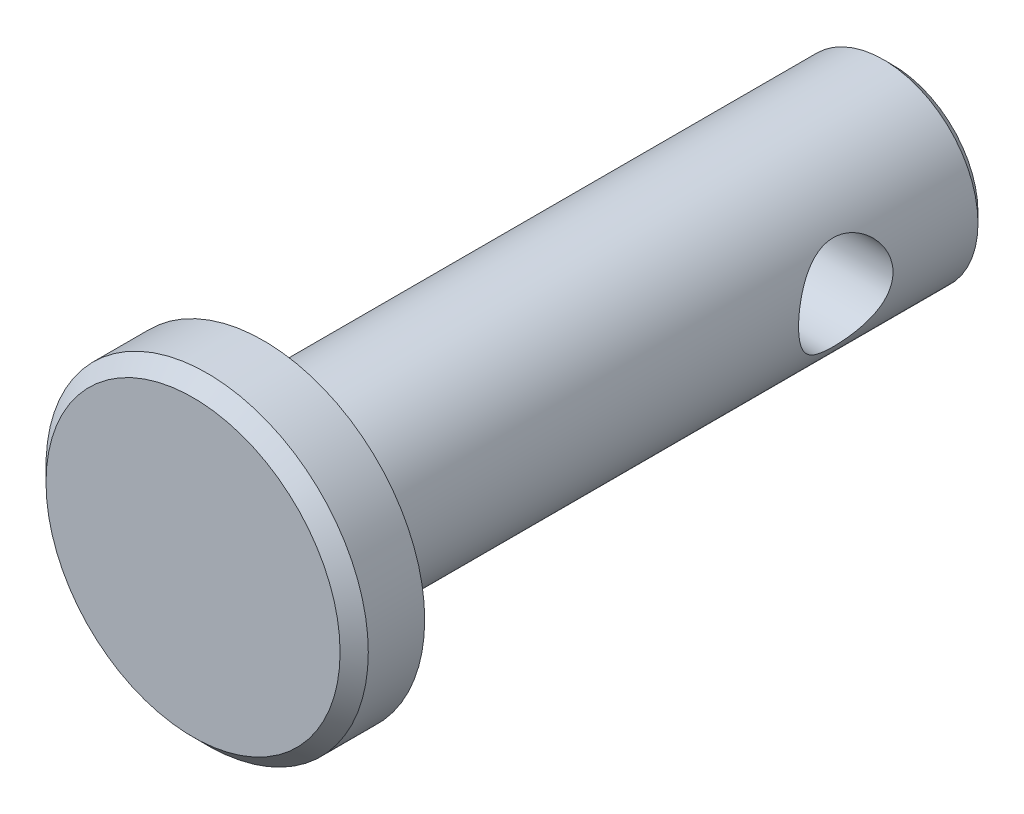
ISO-10303-21;
HEADER;
FILE_DESCRIPTION(('STEP AP214'),'2;1');
FILE_NAME('part.step','',(''),(''),'','','');
FILE_SCHEMA(('AUTOMOTIVE_DESIGN { 1 0 10303 214 1 1 1 1 }'));
ENDSEC;
DATA;
#1=APPLICATION_CONTEXT('core data for automotive mechanical design processes');
#2=APPLICATION_PROTOCOL_DEFINITION('international standard','automotive_design',2000,#1);
#3=PRODUCT_CONTEXT('',#1,'mechanical');
#4=PRODUCT('Part','Part','',(#3));
#5=PRODUCT_RELATED_PRODUCT_CATEGORY('part','',(#4));
#6=PRODUCT_DEFINITION_FORMATION('','',#4);
#7=PRODUCT_DEFINITION_CONTEXT('part definition',#1,'design');
#8=PRODUCT_DEFINITION('design','',#6,#7);
#9=PRODUCT_DEFINITION_SHAPE('','',#8);
#10=(LENGTH_UNIT() NAMED_UNIT(*) SI_UNIT(.MILLI.,.METRE.));
#11=(NAMED_UNIT(*) PLANE_ANGLE_UNIT() SI_UNIT($,.RADIAN.));
#12=(NAMED_UNIT(*) SI_UNIT($,.STERADIAN.) SOLID_ANGLE_UNIT());
#13=UNCERTAINTY_MEASURE_WITH_UNIT(LENGTH_MEASURE(1.E-05),#10,'distance_accuracy_value','');
#14=(GEOMETRIC_REPRESENTATION_CONTEXT(3) GLOBAL_UNCERTAINTY_ASSIGNED_CONTEXT((#13)) GLOBAL_UNIT_ASSIGNED_CONTEXT((#10,
#11,#12)) REPRESENTATION_CONTEXT('',''));
#15=CARTESIAN_POINT('',(0.,0.,0.));
#16=DIRECTION('',(0.,0.,1.));
#17=DIRECTION('',(1.,0.,0.));
#18=AXIS2_PLACEMENT_3D('',#15,#16,#17);
#19=CARTESIAN_POINT('',(0.,0.,7.9375));
#20=DIRECTION('',(0.,0.,-1.));
#21=DIRECTION('',(-1.,0.,0.));
#22=AXIS2_PLACEMENT_3D('',#19,#20,#21);
#23=CYLINDRICAL_SURFACE('',#22,2.38125);
#24=CARTESIAN_POINT('',(0.,0.,-7.699375));
#25=DIRECTION('',(0.,0.,1.));
#26=DIRECTION('',(1.,0.,0.));
#27=AXIS2_PLACEMENT_3D('',#24,#25,#26);
#28=CIRCLE('',#27,2.38125);
#29=CARTESIAN_POINT('',(2.38125,0.,-7.699375));
#30=VERTEX_POINT('',#29);
#31=EDGE_CURVE('E37',#30,#30,#28,.T.);
#32=ORIENTED_EDGE('',*,*,#31,.T.);
#33=EDGE_LOOP('',(#32));
#34=FACE_BOUND('',#33,.T.);
#35=CARTESIAN_POINT('',(-2.38125,0.,-3.17499999999999));
#36=CARTESIAN_POINT('',(-2.38124658771817,-0.0625934933908996,-3.17500393182414));
#37=CARTESIAN_POINT('',(-2.37875553370113,-0.12526160776547,-3.17996499331048));
#38=CARTESIAN_POINT('',(-2.36903604532025,-0.248745655116469,-3.19958983565589));
#39=CARTESIAN_POINT('',(-2.36179861446384,-0.309557840743266,-3.21427204291281));
#40=CARTESIAN_POINT('',(-2.34334382664568,-0.427355251873435,-3.25262137838436));
#41=CARTESIAN_POINT('',(-2.33214194770735,-0.484354349749462,-3.27625358874528));
#42=CARTESIAN_POINT('',(-2.30678565164099,-0.593493959385318,-3.33165127106262));
#43=CARTESIAN_POINT('',(-2.29263146732421,-0.645634853781904,-3.36341610174628));
#44=CARTESIAN_POINT('',(-2.26166669988499,-0.747126495522786,-3.43636272516842));
#45=CARTESIAN_POINT('',(-2.24474721461222,-0.796117610742266,-3.47799796434469));
#46=CARTESIAN_POINT('',(-2.2105140207503,-0.886753026544747,-3.56852713622849));
#47=CARTESIAN_POINT('',(-2.19320002298882,-0.928391728636495,-3.61742654851655));
#48=CARTESIAN_POINT('',(-2.15859063769341,-1.00637816303611,-3.72564423802627));
#49=CARTESIAN_POINT('',(-2.14140081986313,-1.04206516514117,-3.78547641709309));
#50=CARTESIAN_POINT('',(-2.11081118475794,-1.10271904514174,-3.91124360940858));
#51=CARTESIAN_POINT('',(-2.09740866244572,-1.12769358094429,-3.97717422201051));
#52=CARTESIAN_POINT('',(-2.07713897941891,-1.16458893898079,-4.10924189114297));
#53=CARTESIAN_POINT('',(-2.06992860854359,-1.1772017235864,-4.17513030074273));
#54=CARTESIAN_POINT('',(-2.06194687719966,-1.19113338890835,-4.30844980373118));
#55=CARTESIAN_POINT('',(-2.06116915374352,-1.19246343021919,-4.37587930647471));
#56=CARTESIAN_POINT('',(-2.06586451337536,-1.18429955128952,-4.50169679770048));
#57=CARTESIAN_POINT('',(-2.07060121735085,-1.17608099119853,-4.56020173717493));
#58=CARTESIAN_POINT('',(-2.0845013483624,-1.15126275778341,-4.67485639834727));
#59=CARTESIAN_POINT('',(-2.09366618546583,-1.13466041470314,-4.73100536362913));
#60=CARTESIAN_POINT('',(-2.1155915160392,-1.09324351977209,-4.84095718596098));
#61=CARTESIAN_POINT('',(-2.12843079040573,-1.06824668928498,-4.89467493105432));
#62=CARTESIAN_POINT('',(-2.15626240722546,-1.01089025937972,-4.99741145461497));
#63=CARTESIAN_POINT('',(-2.17125571566414,-0.978527352789223,-5.04642810832385));
#64=CARTESIAN_POINT('',(-2.20400353628599,-0.902572396630542,-5.1449143665474));
#65=CARTESIAN_POINT('',(-2.22186710625626,-0.858076839495929,-5.1936533401016));
#66=CARTESIAN_POINT('',(-2.25680138992047,-0.761470860938951,-5.28328185775978));
#67=CARTESIAN_POINT('',(-2.27387172175947,-0.709356821108762,-5.32416765051534));
#68=CARTESIAN_POINT('',(-2.30626428608779,-0.595927464756048,-5.39871324016351));
#69=CARTESIAN_POINT('',(-2.3214685301789,-0.534297244998049,-5.4319493125057));
#70=CARTESIAN_POINT('',(-2.34741102209979,-0.405367587816351,-5.48730927520433));
#71=CARTESIAN_POINT('',(-2.35815281492167,-0.338072701740847,-5.50944198903368));
#72=CARTESIAN_POINT('',(-2.37320534860897,-0.205700104133525,-5.54014727755016));
#73=CARTESIAN_POINT('',(-2.37797504664999,-0.140900384809101,-5.549691127561));
#74=CARTESIAN_POINT('',(-2.38211931649743,-0.0104532111897008,-5.557993945507));
#75=CARTESIAN_POINT('',(-2.38149644415062,0.0551938267826,-5.5567580225895));
#76=CARTESIAN_POINT('',(-2.37519200776753,0.180061757270823,-5.54409766160142));
#77=CARTESIAN_POINT('',(-2.36990626897501,0.239386357709476,-5.5334703282183));
#78=CARTESIAN_POINT('',(-2.35532022721706,0.355290706146969,-5.50357904564991));
#79=CARTESIAN_POINT('',(-2.34601948166815,0.411870150775843,-5.48431414431646));
#80=CARTESIAN_POINT('',(-2.323912493394,0.522551749435383,-5.437189325903));
#81=CARTESIAN_POINT('',(-2.31101362357334,0.576536816435452,-5.40909940595466));
#82=CARTESIAN_POINT('',(-2.28295169421308,0.679205558772778,-5.34538134037143));
#83=CARTESIAN_POINT('',(-2.26778767095513,0.727886962326195,-5.30974998349969));
#84=CARTESIAN_POINT('',(-2.23490101029919,0.823635905061684,-5.22792274358804));
#85=CARTESIAN_POINT('',(-2.21707334772675,0.87007550515996,-5.18103302224747));
#86=CARTESIAN_POINT('',(-2.18196785003363,0.954710182325451,-5.08008911676998));
#87=CARTESIAN_POINT('',(-2.1646904022613,0.992899556088159,-5.02603001790925));
#88=CARTESIAN_POINT('',(-2.13182825744162,1.06168973569882,-4.90897427421775));
#89=CARTESIAN_POINT('',(-2.11636605630571,1.0918334810305,-4.84567158617039));
#90=CARTESIAN_POINT('',(-2.090428799133,1.14071736472269,-4.71387082565358));
#91=CARTESIAN_POINT('',(-2.07994732092736,1.15947219672864,-4.64537957625952));
#92=CARTESIAN_POINT('',(-2.06646662138444,1.18331657161978,-4.51217876590558));
#93=CARTESIAN_POINT('',(-2.06284572182647,1.18954509883978,-4.44773734201105));
#94=CARTESIAN_POINT('',(-2.06175000375602,1.19144552443463,-4.31865833564984));
#95=CARTESIAN_POINT('',(-2.06427252119055,1.18712199863718,-4.2540208503446));
#96=CARTESIAN_POINT('',(-2.0745195450331,1.16910579328329,-4.13287745598844));
#97=CARTESIAN_POINT('',(-2.081725593681,1.1563448992644,-4.07618350273431));
#98=CARTESIAN_POINT('',(-2.09991741148739,1.12296816088622,-3.96580345780995));
#99=CARTESIAN_POINT('',(-2.11090439637645,1.10234978978715,-3.91211834007174));
#100=CARTESIAN_POINT('',(-2.13632093965266,1.05229312174863,-3.80528728679406));
#101=CARTESIAN_POINT('',(-2.15093219477964,1.02235532346272,-3.752419904384));
#102=CARTESIAN_POINT('',(-2.18164566727434,0.955061000604871,-3.65211375535998));
#103=CARTESIAN_POINT('',(-2.19774865799103,0.917700616381019,-3.60467783335141));
#104=CARTESIAN_POINT('',(-2.23197328511557,0.831298335810092,-3.51058720225545));
#105=CARTESIAN_POINT('',(-2.25010245755217,0.781388641146489,-3.46472775625033));
#106=CARTESIAN_POINT('',(-2.28454448778714,0.674078066156023,-3.38185563536123));
#107=CARTESIAN_POINT('',(-2.30085636405197,0.616673173627613,-3.34484772899556));
#108=CARTESIAN_POINT('',(-2.33002942662263,0.495218557463752,-3.28068420558624));
#109=CARTESIAN_POINT('',(-2.34286539970213,0.431124721872153,-3.2536000982945));
#110=CARTESIAN_POINT('',(-2.36340659560876,0.298539814353399,-3.21094715007149));
#111=CARTESIAN_POINT('',(-2.37112639390897,0.230061848926334,-3.19534558236852));
#112=CARTESIAN_POINT('',(-2.37762409336193,0.13406669253178,-3.18226589493781));
#113=CARTESIAN_POINT('',(-2.37898025606987,0.107348987707654,-3.17954504322174));
#114=CARTESIAN_POINT('',(-2.3807939546427,0.0537587806828974,-3.17591122636904));
#115=CARTESIAN_POINT('',(-2.38125146570418,0.0268862742301637,-3.17499831113272));
#116=CARTESIAN_POINT('',(-2.38125,0.,-3.17499999999999));
#117=B_SPLINE_CURVE_WITH_KNOTS('',3,(#35,#36,#37,#38,#39,#40,#41,#42,#43,#44,#45,#46,#47,#48,
#49,#50,#51,#52,#53,#54,#55,#56,#57,#58,#59,#60,#61,#62,#63,#64,#65,#66,#67,#68,#69,#70,#71,#72,
#73,#74,#75,#76,#77,#78,#79,#80,#81,#82,#83,#84,#85,#86,#87,#88,#89,#90,#91,#92,#93,#94,#95,#96,
#97,#98,#99,#100,#101,#102,#103,#104,#105,#106,#107,#108,#109,#110,#111,#112,#113,#114,#115,
#116),.UNSPECIFIED.,.T.,.F.,(4,2,2,2,2,2,2,2,2,2,2,2,2,2,2,2,2,2,2,2,2,2,2,2,2,2,2,2,2,2,2,2,2,
2,2,2,2,2,2,2,4),(0.,0.187671381491036,0.375699515747514,0.563001503883019,0.75028872744243,
0.948906406473726,1.14767467670684,1.36185743031615,1.57588681716391,1.77710320704461,
1.97812053569865,2.15509926337348,2.33213438424011,2.51329317200606,2.69453345625452,
2.8987544577565,3.10307277131561,3.31687910824069,3.53051527011184,3.72645730217447,
3.92230647121477,4.10297598058852,4.28366541066829,4.46952119208218,4.65545627297242,
4.85965036423512,5.06398516445249,5.27821543446363,5.4921687202949,5.68558331740252,
5.8789140564582,6.05382723196981,6.22879670208068,6.41552156348467,6.60234377481073,
6.81186617152195,7.02150118957733,7.23261841267422,7.44313156831559,7.52374130413948,
7.60435326481741),.UNSPECIFIED.);
#118=CARTESIAN_POINT('',(-2.38125,0.,-3.17499999999999));
#119=VERTEX_POINT('',#118);
#120=EDGE_CURVE('E48',#119,#119,#117,.T.);
#121=ORIENTED_EDGE('',*,*,#120,.T.);
#122=EDGE_LOOP('',(#121));
#123=FACE_BOUND('',#122,.T.);
#124=CARTESIAN_POINT('',(2.38125,0.,-5.55624999999999));
#125=CARTESIAN_POINT('',(2.38124658771817,-0.0625934933908996,-5.55624606817584));
#126=CARTESIAN_POINT('',(2.37875553370113,-0.12526160776547,-5.5512850066895));
#127=CARTESIAN_POINT('',(2.36903604532025,-0.248745655116469,-5.53166016434409));
#128=CARTESIAN_POINT('',(2.36179861446384,-0.309557840743266,-5.51697795708717));
#129=CARTESIAN_POINT('',(2.34334382664568,-0.427355251873434,-5.47862862161562));
#130=CARTESIAN_POINT('',(2.33214194770735,-0.484354349749461,-5.4549964112547));
#131=CARTESIAN_POINT('',(2.30678565164099,-0.593493959385317,-5.39959872893736));
#132=CARTESIAN_POINT('',(2.29263146732422,-0.645634853781904,-5.3678338982537));
#133=CARTESIAN_POINT('',(2.26166669988499,-0.747126495522786,-5.29488727483156));
#134=CARTESIAN_POINT('',(2.24474721461222,-0.796117610742266,-5.2532520356553));
#135=CARTESIAN_POINT('',(2.2105140207503,-0.886753026544746,-5.16272286377149));
#136=CARTESIAN_POINT('',(2.19320002298882,-0.928391728636495,-5.11382345148343));
#137=CARTESIAN_POINT('',(2.15859063769341,-1.00637816303611,-5.00560576197372));
#138=CARTESIAN_POINT('',(2.14140081986313,-1.04206516514117,-4.94577358290689));
#139=CARTESIAN_POINT('',(2.11081118475794,-1.10271904514174,-4.82000639059141));
#140=CARTESIAN_POINT('',(2.09740866244572,-1.12769358094429,-4.75407577798947));
#141=CARTESIAN_POINT('',(2.07713897941891,-1.16458893898079,-4.62200810885702));
#142=CARTESIAN_POINT('',(2.06992860854359,-1.1772017235864,-4.55611969925725));
#143=CARTESIAN_POINT('',(2.06194687719966,-1.19113338890835,-4.4228001962688));
#144=CARTESIAN_POINT('',(2.06116915374352,-1.19246343021919,-4.35537069352527));
#145=CARTESIAN_POINT('',(2.06586451337536,-1.18429955128952,-4.22955320229951));
#146=CARTESIAN_POINT('',(2.07060121735085,-1.17608099119853,-4.17104826282505));
#147=CARTESIAN_POINT('',(2.0845013483624,-1.15126275778341,-4.05639360165271));
#148=CARTESIAN_POINT('',(2.09366618546583,-1.13466041470314,-4.00024463637085));
#149=CARTESIAN_POINT('',(2.1155915160392,-1.09324351977209,-3.890292814039));
#150=CARTESIAN_POINT('',(2.12843079040573,-1.06824668928498,-3.83657506894566));
#151=CARTESIAN_POINT('',(2.15626240722546,-1.01089025937972,-3.73383854538501));
#152=CARTESIAN_POINT('',(2.17125571566414,-0.978527352789222,-3.68482189167614));
#153=CARTESIAN_POINT('',(2.20400353628599,-0.902572396630542,-3.58633563345259));
#154=CARTESIAN_POINT('',(2.22186710625626,-0.858076839495929,-3.53759665989838));
#155=CARTESIAN_POINT('',(2.25680138992047,-0.761470860938951,-3.4479681422402));
#156=CARTESIAN_POINT('',(2.27387172175947,-0.709356821108762,-3.40708234948465));
#157=CARTESIAN_POINT('',(2.30626428608779,-0.595927464756047,-3.33253675983647));
#158=CARTESIAN_POINT('',(2.3214685301789,-0.534297244998049,-3.29930068749428));
#159=CARTESIAN_POINT('',(2.34741102209979,-0.405367587816351,-3.24394072479566));
#160=CARTESIAN_POINT('',(2.35815281492167,-0.338072701740847,-3.22180801096631));
#161=CARTESIAN_POINT('',(2.37320534860897,-0.205700104133525,-3.19110272244982));
#162=CARTESIAN_POINT('',(2.37797504664999,-0.1409003848091,-3.18155887243898));
#163=CARTESIAN_POINT('',(2.38211931649743,-0.0104532111897006,-3.17325605449299));
#164=CARTESIAN_POINT('',(2.38149644415062,0.0551938267826001,-3.17449197741048));
#165=CARTESIAN_POINT('',(2.37519200776753,0.180061757270823,-3.18715233839857));
#166=CARTESIAN_POINT('',(2.36990626897501,0.239386357709476,-3.19777967178168));
#167=CARTESIAN_POINT('',(2.35532022721706,0.35529070614697,-3.22767095435007));
#168=CARTESIAN_POINT('',(2.34601948166815,0.411870150775843,-3.24693585568352));
#169=CARTESIAN_POINT('',(2.323912493394,0.522551749435383,-3.29406067409698));
#170=CARTESIAN_POINT('',(2.31101362357334,0.576536816435452,-3.32215059404532));
#171=CARTESIAN_POINT('',(2.28295169421308,0.679205558772779,-3.38586865962856));
#172=CARTESIAN_POINT('',(2.26778767095513,0.727886962326196,-3.42150001650029));
#173=CARTESIAN_POINT('',(2.23490101029918,0.823635905061685,-3.50332725641194));
#174=CARTESIAN_POINT('',(2.21707334772675,0.870075505159962,-3.55021697775251));
#175=CARTESIAN_POINT('',(2.18196785003363,0.954710182325452,-3.65116088323));
#176=CARTESIAN_POINT('',(2.1646904022613,0.992899556088159,-3.70521998209073));
#177=CARTESIAN_POINT('',(2.13182825744162,1.06168973569882,-3.82227572578223));
#178=CARTESIAN_POINT('',(2.11636605630571,1.0918334810305,-3.8855784138296));
#179=CARTESIAN_POINT('',(2.090428799133,1.14071736472269,-4.0173791743464));
#180=CARTESIAN_POINT('',(2.07994732092736,1.15947219672864,-4.08587042374046));
#181=CARTESIAN_POINT('',(2.06646662138444,1.18331657161978,-4.2190712340944));
#182=CARTESIAN_POINT('',(2.06284572182647,1.18954509883978,-4.28351265798893));
#183=CARTESIAN_POINT('',(2.06175000375602,1.19144552443463,-4.41259166435014));
#184=CARTESIAN_POINT('',(2.06427252119055,1.18712199863718,-4.47722914965538));
#185=CARTESIAN_POINT('',(2.0745195450331,1.16910579328329,-4.59837254401155));
#186=CARTESIAN_POINT('',(2.081725593681,1.1563448992644,-4.65506649726567));
#187=CARTESIAN_POINT('',(2.09991741148739,1.12296816088622,-4.76544654219003));
#188=CARTESIAN_POINT('',(2.11090439637645,1.10234978978715,-4.81913165992824));
#189=CARTESIAN_POINT('',(2.13632093965266,1.05229312174863,-4.92596271320592));
#190=CARTESIAN_POINT('',(2.15093219477964,1.02235532346272,-4.97883009561598));
#191=CARTESIAN_POINT('',(2.18164566727434,0.955061000604872,-5.07913624464));
#192=CARTESIAN_POINT('',(2.19774865799103,0.91770061638102,-5.12657216664857));
#193=CARTESIAN_POINT('',(2.23197328511557,0.831298335810092,-5.22066279774453));
#194=CARTESIAN_POINT('',(2.25010245755217,0.781388641146489,-5.26652224374965));
#195=CARTESIAN_POINT('',(2.28454448778714,0.674078066156024,-5.34939436463875));
#196=CARTESIAN_POINT('',(2.30085636405197,0.616673173627613,-5.38640227100442));
#197=CARTESIAN_POINT('',(2.33002942662263,0.495218557463752,-5.45056579441374));
#198=CARTESIAN_POINT('',(2.34286539970213,0.431124721872153,-5.47764990170548));
#199=CARTESIAN_POINT('',(2.36340659560876,0.298539814353399,-5.52030284992849));
#200=CARTESIAN_POINT('',(2.37112639390897,0.230061848926334,-5.53590441763146));
#201=CARTESIAN_POINT('',(2.37762409336193,0.134066692531781,-5.54898410506218));
#202=CARTESIAN_POINT('',(2.37898025606987,0.107348987707655,-5.55170495677824));
#203=CARTESIAN_POINT('',(2.3807939546427,0.0537587806828979,-5.55533877363094));
#204=CARTESIAN_POINT('',(2.38125146570418,0.0268862742301639,-5.55625168886727));
#205=CARTESIAN_POINT('',(2.38125,0.,-5.55624999999999));
#206=B_SPLINE_CURVE_WITH_KNOTS('',3,(#124,#125,#126,#127,#128,#129,#130,#131,#132,#133,#134,
#135,#136,#137,#138,#139,#140,#141,#142,#143,#144,#145,#146,#147,#148,#149,#150,#151,#152,#153,
#154,#155,#156,#157,#158,#159,#160,#161,#162,#163,#164,#165,#166,#167,#168,#169,#170,#171,#172,
#173,#174,#175,#176,#177,#178,#179,#180,#181,#182,#183,#184,#185,#186,#187,#188,#189,#190,#191,
#192,#193,#194,#195,#196,#197,#198,#199,#200,#201,#202,#203,#204,#205),.UNSPECIFIED.,.T.,.F.,(4,
2,2,2,2,2,2,2,2,2,2,2,2,2,2,2,2,2,2,2,2,2,2,2,2,2,2,2,2,2,2,2,2,2,2,2,2,2,2,2,4),(0.,
0.187671381491036,0.375699515747514,0.563001503883018,0.75028872744243,0.948906406473726,
1.14767467670684,1.36185743031615,1.57588681716391,1.77710320704461,1.97812053569865,
2.15509926337348,2.33213438424011,2.51329317200606,2.69453345625452,2.8987544577565,
3.10307277131561,3.31687910824069,3.53051527011183,3.72645730217447,3.92230647121477,
4.10297598058852,4.28366541066829,4.46952119208218,4.65545627297242,4.85965036423512,
5.06398516445249,5.27821543446363,5.4921687202949,5.68558331740252,5.8789140564582,
6.05382723196981,6.22879670208068,6.41552156348467,6.60234377481073,6.81186617152195,
7.02150118957733,7.23261841267422,7.44313156831559,7.52374130413948,7.60435326481741),.UNSPECIFIED.);
#207=CARTESIAN_POINT('',(2.38125,0.,-5.55624999999999));
#208=VERTEX_POINT('',#207);
#209=EDGE_CURVE('E56',#208,#208,#206,.T.);
#210=ORIENTED_EDGE('',*,*,#209,.T.);
#211=EDGE_LOOP('',(#210));
#212=FACE_BOUND('',#211,.T.);
#213=CARTESIAN_POINT('',(0.,0.,7.9375));
#214=DIRECTION('',(0.,0.,1.));
#215=DIRECTION('',(1.,0.,0.));
#216=AXIS2_PLACEMENT_3D('',#213,#214,#215);
#217=CIRCLE('',#216,2.38125);
#218=CARTESIAN_POINT('',(2.38125,0.,7.9375));
#219=VERTEX_POINT('',#218);
#220=EDGE_CURVE('E94',#219,#219,#217,.T.);
#221=ORIENTED_EDGE('',*,*,#220,.F.);
#222=EDGE_LOOP('',(#221));
#223=FACE_BOUND('',#222,.T.);
#224=ADVANCED_FACE('F30',(#34,#123,#212,#223),#23,.T.);
#225=CARTESIAN_POINT('',(0.,0.,-7.9375));
#226=DIRECTION('',(0.,0.,1.));
#227=DIRECTION('',(1.,0.,0.));
#228=AXIS2_PLACEMENT_3D('',#225,#226,#227);
#229=PLANE('',#228);
#230=CARTESIAN_POINT('',(0.,0.,-7.9375));
#231=DIRECTION('',(0.,0.,1.));
#232=DIRECTION('',(1.,0.,0.));
#233=AXIS2_PLACEMENT_3D('',#230,#231,#232);
#234=CIRCLE('',#233,2.143125);
#235=CARTESIAN_POINT('',(2.143125,0.,-7.9375));
#236=VERTEX_POINT('',#235);
#237=EDGE_CURVE('E10',#236,#236,#234,.F.);
#238=ORIENTED_EDGE('',*,*,#237,.T.);
#239=EDGE_LOOP('',(#238));
#240=FACE_BOUND('',#239,.T.);
#241=ADVANCED_FACE('F76',(#240),#229,.F.);
#242=CARTESIAN_POINT('',(0.,0.,7.9375));
#243=DIRECTION('',(0.,0.,1.));
#244=DIRECTION('',(1.,0.,0.));
#245=AXIS2_PLACEMENT_3D('',#242,#243,#244);
#246=PLANE('',#245);
#247=CARTESIAN_POINT('',(0.,0.,7.9375));
#248=DIRECTION('',(0.,0.,1.));
#249=DIRECTION('',(1.,0.,0.));
#250=AXIS2_PLACEMENT_3D('',#247,#248,#249);
#251=CIRCLE('',#250,4.064);
#252=CARTESIAN_POINT('',(4.064,0.,7.9375));
#253=VERTEX_POINT('',#252);
#254=EDGE_CURVE('E55',#253,#253,#251,.T.);
#255=ORIENTED_EDGE('',*,*,#254,.F.);
#256=EDGE_LOOP('',(#255));
#257=FACE_BOUND('',#256,.T.);
#258=ORIENTED_EDGE('',*,*,#220,.T.);
#259=EDGE_LOOP('',(#258));
#260=FACE_BOUND('',#259,.T.);
#261=ADVANCED_FACE('F73',(#257,#260),#246,.F.);
#262=CARTESIAN_POINT('',(0.,0.,9.7155));
#263=DIRECTION('',(0.,0.,-1.));
#264=DIRECTION('',(-1.,0.,0.));
#265=AXIS2_PLACEMENT_3D('',#262,#263,#264);
#266=CYLINDRICAL_SURFACE('',#265,4.064);
#267=CARTESIAN_POINT('',(0.,0.,9.3599));
#268=DIRECTION('',(0.,0.,1.));
#269=DIRECTION('',(1.,0.,0.));
#270=AXIS2_PLACEMENT_3D('',#267,#268,#269);
#271=CIRCLE('',#270,4.064);
#272=CARTESIAN_POINT('',(4.064,0.,9.3599));
#273=VERTEX_POINT('',#272);
#274=EDGE_CURVE('E41',#273,#273,#271,.F.);
#275=ORIENTED_EDGE('',*,*,#274,.T.);
#276=EDGE_LOOP('',(#275));
#277=FACE_BOUND('',#276,.T.);
#278=ORIENTED_EDGE('',*,*,#254,.T.);
#279=EDGE_LOOP('',(#278));
#280=FACE_BOUND('',#279,.T.);
#281=ADVANCED_FACE('F71',(#277,#280),#266,.T.);
#282=CARTESIAN_POINT('',(0.,0.,9.7155));
#283=DIRECTION('',(0.,0.,1.));
#284=DIRECTION('',(1.,0.,0.));
#285=AXIS2_PLACEMENT_3D('',#282,#283,#284);
#286=PLANE('',#285);
#287=CARTESIAN_POINT('',(0.,0.,9.7155));
#288=DIRECTION('',(0.,0.,1.));
#289=DIRECTION('',(1.,0.,0.));
#290=AXIS2_PLACEMENT_3D('',#287,#288,#289);
#291=CIRCLE('',#290,3.7084);
#292=CARTESIAN_POINT('',(3.7084,0.,9.7155));
#293=VERTEX_POINT('',#292);
#294=EDGE_CURVE('E45',#293,#293,#291,.T.);
#295=ORIENTED_EDGE('',*,*,#294,.T.);
#296=EDGE_LOOP('',(#295));
#297=FACE_BOUND('',#296,.T.);
#298=ADVANCED_FACE('F67',(#297),#286,.T.);
#299=CARTESIAN_POINT('',(0.,0.,9.7155));
#300=DIRECTION('',(0.,0.,-1.));
#301=DIRECTION('',(-1.,0.,0.));
#302=AXIS2_PLACEMENT_3D('',#299,#300,#301);
#303=CONICAL_SURFACE('',#302,3.7084,0.785398163397448);
#304=ORIENTED_EDGE('',*,*,#274,.F.);
#305=EDGE_LOOP('',(#304));
#306=FACE_BOUND('',#305,.T.);
#307=ORIENTED_EDGE('',*,*,#294,.F.);
#308=EDGE_LOOP('',(#307));
#309=FACE_BOUND('',#308,.T.);
#310=ADVANCED_FACE('F65',(#306,#309),#303,.T.);
#311=CARTESIAN_POINT('',(-4.064,0.,-4.36562499999999));
#312=DIRECTION('',(1.,0.,0.));
#313=DIRECTION('',(0.,0.,-1.));
#314=AXIS2_PLACEMENT_3D('',#311,#312,#313);
#315=CYLINDRICAL_SURFACE('',#314,1.190625);
#316=ORIENTED_EDGE('',*,*,#209,.F.);
#317=EDGE_LOOP('',(#316));
#318=FACE_BOUND('',#317,.T.);
#319=ORIENTED_EDGE('',*,*,#120,.F.);
#320=EDGE_LOOP('',(#319));
#321=FACE_BOUND('',#320,.T.);
#322=ADVANCED_FACE('F61',(#318,#321),#315,.F.);
#323=CARTESIAN_POINT('',(0.,0.,-7.699375));
#324=DIRECTION('',(0.,0.,1.));
#325=DIRECTION('',(1.,0.,0.));
#326=AXIS2_PLACEMENT_3D('',#323,#324,#325);
#327=CONICAL_SURFACE('',#326,2.38125,0.785398163397448);
#328=ORIENTED_EDGE('',*,*,#237,.F.);
#329=EDGE_LOOP('',(#328));
#330=FACE_BOUND('',#329,.T.);
#331=ORIENTED_EDGE('',*,*,#31,.F.);
#332=EDGE_LOOP('',(#331));
#333=FACE_BOUND('',#332,.T.);
#334=ADVANCED_FACE('F32',(#330,#333),#327,.T.);
#335=CLOSED_SHELL('',(#224,#241,#261,#281,#298,#310,#322,#334));
#336=MANIFOLD_SOLID_BREP('B2',#335);
#337=ADVANCED_BREP_SHAPE_REPRESENTATION('',(#18,#336),#14);
#338=SHAPE_DEFINITION_REPRESENTATION(#9,#337);
ENDSEC;
END-ISO-10303-21;
